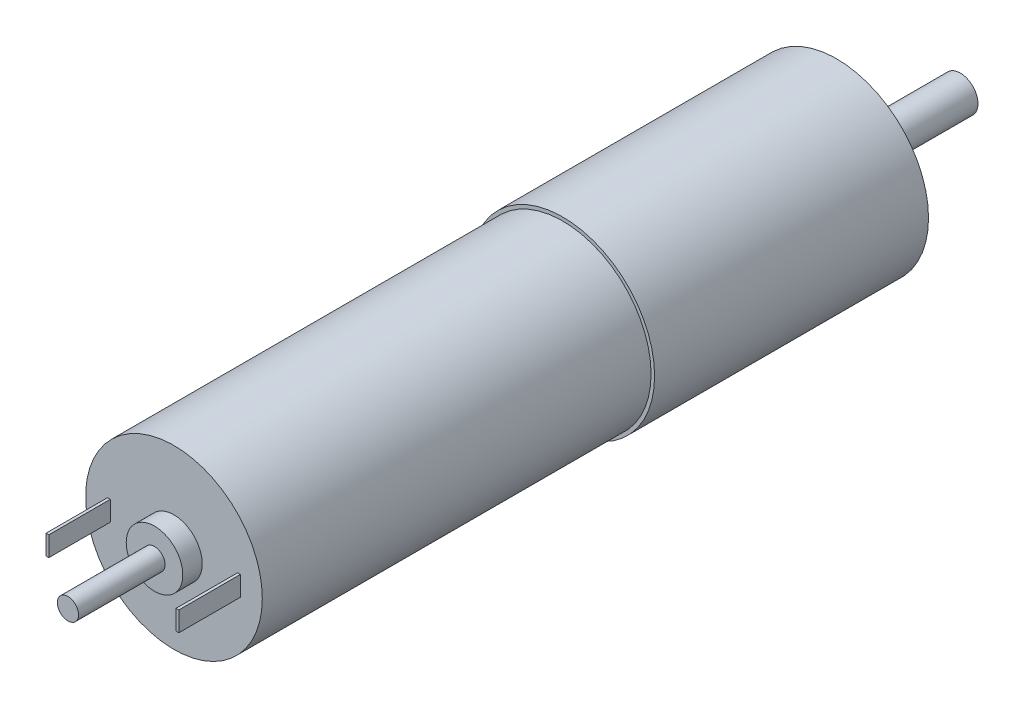
ISO-10303-21;
HEADER;
FILE_DESCRIPTION(('STEP AP214'),'2;1');
FILE_NAME('part.step','',(''),(''),'','','');
FILE_SCHEMA(('AUTOMOTIVE_DESIGN { 1 0 10303 214 1 1 1 1 }'));
ENDSEC;
DATA;
#1=APPLICATION_CONTEXT('core data for automotive mechanical design processes');
#2=APPLICATION_PROTOCOL_DEFINITION('international standard','automotive_design',2000,#1);
#3=PRODUCT_CONTEXT('',#1,'mechanical');
#4=PRODUCT('Part','Part','',(#3));
#5=PRODUCT_RELATED_PRODUCT_CATEGORY('part','',(#4));
#6=PRODUCT_DEFINITION_FORMATION('','',#4);
#7=PRODUCT_DEFINITION_CONTEXT('part definition',#1,'design');
#8=PRODUCT_DEFINITION('design','',#6,#7);
#9=PRODUCT_DEFINITION_SHAPE('','',#8);
#10=(LENGTH_UNIT() NAMED_UNIT(*) SI_UNIT(.MILLI.,.METRE.));
#11=(NAMED_UNIT(*) PLANE_ANGLE_UNIT() SI_UNIT($,.RADIAN.));
#12=(NAMED_UNIT(*) SI_UNIT($,.STERADIAN.) SOLID_ANGLE_UNIT());
#13=UNCERTAINTY_MEASURE_WITH_UNIT(LENGTH_MEASURE(1.E-05),#10,'distance_accuracy_value','');
#14=(GEOMETRIC_REPRESENTATION_CONTEXT(3) GLOBAL_UNCERTAINTY_ASSIGNED_CONTEXT((#13)) GLOBAL_UNIT_ASSIGNED_CONTEXT((#10,
#11,#12)) REPRESENTATION_CONTEXT('',''));
#15=CARTESIAN_POINT('',(0.,0.,0.));
#16=DIRECTION('',(0.,0.,1.));
#17=DIRECTION('',(1.,0.,0.));
#18=AXIS2_PLACEMENT_3D('',#15,#16,#17);
#19=CARTESIAN_POINT('',(0.,0.,0.));
#20=DIRECTION('',(0.,0.,-1.));
#21=DIRECTION('',(1.,0.,0.));
#22=AXIS2_PLACEMENT_3D('',#19,#20,#21);
#23=PLANE('',#22);
#24=CARTESIAN_POINT('',(0.,0.,0.));
#25=DIRECTION('',(0.,0.,1.));
#26=DIRECTION('',(1.,0.,0.));
#27=AXIS2_PLACEMENT_3D('',#24,#25,#26);
#28=CIRCLE('',#27,12.5);
#29=CARTESIAN_POINT('',(12.5,0.,0.));
#30=VERTEX_POINT('',#29);
#31=EDGE_CURVE('E215',#30,#30,#28,.T.);
#32=ORIENTED_EDGE('',*,*,#31,.T.);
#33=EDGE_LOOP('',(#32));
#34=FACE_BOUND('',#33,.T.);
#35=CARTESIAN_POINT('',(0.,0.,0.));
#36=DIRECTION('',(0.,0.,-1.));
#37=DIRECTION('',(-1.,0.,0.));
#38=AXIS2_PLACEMENT_3D('',#35,#36,#37);
#39=CIRCLE('',#38,4.);
#40=CARTESIAN_POINT('',(-4.,0.,0.));
#41=VERTEX_POINT('',#40);
#42=EDGE_CURVE('E11',#41,#41,#39,.T.);
#43=ORIENTED_EDGE('',*,*,#42,.T.);
#44=EDGE_LOOP('',(#43));
#45=FACE_BOUND('',#44,.T.);
#46=DIRECTION('',(1.,0.,0.));
#47=VECTOR('',#46,1.);
#48=CARTESIAN_POINT('',(0.,-1.40000000000001,0.));
#49=LINE('',#48,#47);
#50=CARTESIAN_POINT('',(-9.4,-1.4,0.));
#51=VERTEX_POINT('',#50);
#52=CARTESIAN_POINT('',(-9.,-1.4,0.));
#53=VERTEX_POINT('',#52);
#54=EDGE_CURVE('E154',#51,#53,#49,.T.);
#55=ORIENTED_EDGE('',*,*,#54,.F.);
#56=DIRECTION('',(0.,-1.,0.));
#57=VECTOR('',#56,1.);
#58=CARTESIAN_POINT('',(-9.4,0.,0.));
#59=LINE('',#58,#57);
#60=CARTESIAN_POINT('',(-9.4,1.4,0.));
#61=VERTEX_POINT('',#60);
#62=EDGE_CURVE('E157',#61,#51,#59,.T.);
#63=ORIENTED_EDGE('',*,*,#62,.F.);
#64=DIRECTION('',(-1.,0.,0.));
#65=VECTOR('',#64,1.);
#66=CARTESIAN_POINT('',(0.,1.40000000000001,0.));
#67=LINE('',#66,#65);
#68=CARTESIAN_POINT('',(-9.,1.4,0.));
#69=VERTEX_POINT('',#68);
#70=EDGE_CURVE('E145',#69,#61,#67,.T.);
#71=ORIENTED_EDGE('',*,*,#70,.F.);
#72=DIRECTION('',(0.,1.,0.));
#73=VECTOR('',#72,1.);
#74=CARTESIAN_POINT('',(-9.,0.,0.));
#75=LINE('',#74,#73);
#76=EDGE_CURVE('E119',#53,#69,#75,.T.);
#77=ORIENTED_EDGE('',*,*,#76,.F.);
#78=EDGE_LOOP('',(#55,#63,#71,#77));
#79=FACE_BOUND('',#78,.T.);
#80=DIRECTION('',(-1.,0.,0.));
#81=VECTOR('',#80,1.);
#82=CARTESIAN_POINT('',(0.,-1.40000000000001,0.));
#83=LINE('',#82,#81);
#84=CARTESIAN_POINT('',(9.4,-1.4,0.));
#85=VERTEX_POINT('',#84);
#86=CARTESIAN_POINT('',(9.,-1.4,0.));
#87=VERTEX_POINT('',#86);
#88=EDGE_CURVE('E132',#85,#87,#83,.T.);
#89=ORIENTED_EDGE('',*,*,#88,.T.);
#90=DIRECTION('',(0.,1.,0.));
#91=VECTOR('',#90,1.);
#92=CARTESIAN_POINT('',(9.,0.,0.));
#93=LINE('',#92,#91);
#94=CARTESIAN_POINT('',(9.,1.4,0.));
#95=VERTEX_POINT('',#94);
#96=EDGE_CURVE('E117',#87,#95,#93,.T.);
#97=ORIENTED_EDGE('',*,*,#96,.T.);
#98=DIRECTION('',(1.,0.,0.));
#99=VECTOR('',#98,1.);
#100=CARTESIAN_POINT('',(0.,1.40000000000001,0.));
#101=LINE('',#100,#99);
#102=CARTESIAN_POINT('',(9.4,1.4,0.));
#103=VERTEX_POINT('',#102);
#104=EDGE_CURVE('E126',#95,#103,#101,.T.);
#105=ORIENTED_EDGE('',*,*,#104,.T.);
#106=DIRECTION('',(0.,-1.,0.));
#107=VECTOR('',#106,1.);
#108=CARTESIAN_POINT('',(9.4,0.,0.));
#109=LINE('',#108,#107);
#110=EDGE_CURVE('E123',#103,#85,#109,.T.);
#111=ORIENTED_EDGE('',*,*,#110,.T.);
#112=EDGE_LOOP('',(#89,#97,#105,#111));
#113=FACE_BOUND('',#112,.T.);
#114=ADVANCED_FACE('F39',(#34,#45,#79,#113),#23,.F.);
#115=CARTESIAN_POINT('',(0.,0.,-55.));
#116=DIRECTION('',(0.,0.,1.));
#117=DIRECTION('',(-1.,0.,0.));
#118=AXIS2_PLACEMENT_3D('',#115,#116,#117);
#119=CYLINDRICAL_SURFACE('',#118,12.5);
#120=CARTESIAN_POINT('',(0.,0.,-55.));
#121=DIRECTION('',(0.,0.,1.));
#122=DIRECTION('',(1.,0.,0.));
#123=AXIS2_PLACEMENT_3D('',#120,#121,#122);
#124=CIRCLE('',#123,12.5);
#125=CARTESIAN_POINT('',(12.5,0.,-55.));
#126=VERTEX_POINT('',#125);
#127=EDGE_CURVE('E211',#126,#126,#124,.T.);
#128=ORIENTED_EDGE('',*,*,#127,.T.);
#129=EDGE_LOOP('',(#128));
#130=FACE_BOUND('',#129,.T.);
#131=ORIENTED_EDGE('',*,*,#31,.F.);
#132=EDGE_LOOP('',(#131));
#133=FACE_BOUND('',#132,.T.);
#134=ADVANCED_FACE('F41',(#130,#133),#119,.T.);
#135=CARTESIAN_POINT('',(0.,0.,-93.75));
#136=DIRECTION('',(0.,0.,1.));
#137=DIRECTION('',(-1.,0.,0.));
#138=AXIS2_PLACEMENT_3D('',#135,#136,#137);
#139=CYLINDRICAL_SURFACE('',#138,13.);
#140=CARTESIAN_POINT('',(0.,0.,-93.75));
#141=DIRECTION('',(0.,0.,1.));
#142=DIRECTION('',(1.,0.,0.));
#143=AXIS2_PLACEMENT_3D('',#140,#141,#142);
#144=CIRCLE('',#143,13.);
#145=CARTESIAN_POINT('',(13.,0.,-93.75));
#146=VERTEX_POINT('',#145);
#147=EDGE_CURVE('E212',#146,#146,#144,.T.);
#148=ORIENTED_EDGE('',*,*,#147,.T.);
#149=EDGE_LOOP('',(#148));
#150=FACE_BOUND('',#149,.T.);
#151=CARTESIAN_POINT('',(0.,0.,-55.));
#152=DIRECTION('',(0.,0.,1.));
#153=DIRECTION('',(1.,0.,0.));
#154=AXIS2_PLACEMENT_3D('',#151,#152,#153);
#155=CIRCLE('',#154,13.);
#156=CARTESIAN_POINT('',(13.,0.,-55.));
#157=VERTEX_POINT('',#156);
#158=EDGE_CURVE('E208',#157,#157,#155,.T.);
#159=ORIENTED_EDGE('',*,*,#158,.F.);
#160=EDGE_LOOP('',(#159));
#161=FACE_BOUND('',#160,.T.);
#162=ADVANCED_FACE('F225',(#150,#161),#139,.T.);
#163=CARTESIAN_POINT('',(0.,0.,-93.75));
#164=DIRECTION('',(0.,0.,-1.));
#165=DIRECTION('',(1.,0.,0.));
#166=AXIS2_PLACEMENT_3D('',#163,#164,#165);
#167=PLANE('',#166);
#168=CARTESIAN_POINT('',(0.,10.,-93.75));
#169=DIRECTION('',(0.,0.,1.));
#170=DIRECTION('',(1.,0.,0.));
#171=AXIS2_PLACEMENT_3D('',#168,#169,#170);
#172=CIRCLE('',#171,1.);
#173=CARTESIAN_POINT('',(1.,10.,-93.75));
#174=VERTEX_POINT('',#173);
#175=EDGE_CURVE('E180',#174,#174,#172,.T.);
#176=ORIENTED_EDGE('',*,*,#175,.T.);
#177=EDGE_LOOP('',(#176));
#178=FACE_BOUND('',#177,.T.);
#179=CARTESIAN_POINT('',(10.,0.,-93.75));
#180=DIRECTION('',(0.,0.,1.));
#181=DIRECTION('',(1.,0.,0.));
#182=AXIS2_PLACEMENT_3D('',#179,#180,#181);
#183=CIRCLE('',#182,0.999999999999999);
#184=CARTESIAN_POINT('',(11.,0.,-93.75));
#185=VERTEX_POINT('',#184);
#186=EDGE_CURVE('E186',#185,#185,#183,.T.);
#187=ORIENTED_EDGE('',*,*,#186,.T.);
#188=EDGE_LOOP('',(#187));
#189=FACE_BOUND('',#188,.T.);
#190=CARTESIAN_POINT('',(0.,-10.,-93.75));
#191=DIRECTION('',(0.,0.,1.));
#192=DIRECTION('',(1.,0.,0.));
#193=AXIS2_PLACEMENT_3D('',#190,#191,#192);
#194=CIRCLE('',#193,1.);
#195=CARTESIAN_POINT('',(1.,-10.,-93.75));
#196=VERTEX_POINT('',#195);
#197=EDGE_CURVE('E192',#196,#196,#194,.T.);
#198=ORIENTED_EDGE('',*,*,#197,.T.);
#199=EDGE_LOOP('',(#198));
#200=FACE_BOUND('',#199,.T.);
#201=CARTESIAN_POINT('',(-10.,0.,-93.75));
#202=DIRECTION('',(0.,0.,1.));
#203=DIRECTION('',(1.,0.,0.));
#204=AXIS2_PLACEMENT_3D('',#201,#202,#203);
#205=CIRCLE('',#204,0.999999999999999);
#206=CARTESIAN_POINT('',(-9.,0.,-93.75));
#207=VERTEX_POINT('',#206);
#208=EDGE_CURVE('E174',#207,#207,#205,.T.);
#209=ORIENTED_EDGE('',*,*,#208,.T.);
#210=EDGE_LOOP('',(#209));
#211=FACE_BOUND('',#210,.T.);
#212=CARTESIAN_POINT('',(0.,0.,-93.75));
#213=DIRECTION('',(0.,0.,1.));
#214=DIRECTION('',(1.,0.,0.));
#215=AXIS2_PLACEMENT_3D('',#212,#213,#214);
#216=CIRCLE('',#215,7.);
#217=CARTESIAN_POINT('',(-7.,0.,-93.75));
#218=VERTEX_POINT('',#217);
#219=EDGE_CURVE('E205',#218,#218,#216,.T.);
#220=ORIENTED_EDGE('',*,*,#219,.T.);
#221=EDGE_LOOP('',(#220));
#222=FACE_BOUND('',#221,.T.);
#223=ORIENTED_EDGE('',*,*,#147,.F.);
#224=EDGE_LOOP('',(#223));
#225=FACE_BOUND('',#224,.T.);
#226=ADVANCED_FACE('F231',(#178,#189,#200,#211,#222,#225),#167,.T.);
#227=CARTESIAN_POINT('',(0.,0.,-55.));
#228=DIRECTION('',(0.,0.,-1.));
#229=DIRECTION('',(1.,0.,0.));
#230=AXIS2_PLACEMENT_3D('',#227,#228,#229);
#231=PLANE('',#230);
#232=ORIENTED_EDGE('',*,*,#127,.F.);
#233=EDGE_LOOP('',(#232));
#234=FACE_BOUND('',#233,.T.);
#235=ORIENTED_EDGE('',*,*,#158,.T.);
#236=EDGE_LOOP('',(#235));
#237=FACE_BOUND('',#236,.T.);
#238=ADVANCED_FACE('F236',(#234,#237),#231,.F.);
#239=CARTESIAN_POINT('',(0.,0.,-96.75));
#240=DIRECTION('',(0.,0.,1.));
#241=DIRECTION('',(-1.,0.,0.));
#242=AXIS2_PLACEMENT_3D('',#239,#240,#241);
#243=CYLINDRICAL_SURFACE('',#242,7.);
#244=CARTESIAN_POINT('',(0.,0.,-96.75));
#245=DIRECTION('',(0.,0.,1.));
#246=DIRECTION('',(1.,0.,0.));
#247=AXIS2_PLACEMENT_3D('',#244,#245,#246);
#248=CIRCLE('',#247,7.);
#249=CARTESIAN_POINT('',(-7.,0.,-96.75));
#250=VERTEX_POINT('',#249);
#251=EDGE_CURVE('E202',#250,#250,#248,.T.);
#252=CARTESIAN_POINT('',(-7.,0.,-96.75));
#253=CARTESIAN_POINT('',(-7.,0.,-96.71875));
#254=CARTESIAN_POINT('',(-7.,0.,-96.6875));
#255=CARTESIAN_POINT('',(-7.,0.,-96.625));
#256=CARTESIAN_POINT('',(-7.,0.,-96.59375));
#257=CARTESIAN_POINT('',(-7.,0.,-96.53125));
#258=CARTESIAN_POINT('',(-7.,0.,-96.5));
#259=CARTESIAN_POINT('',(-7.,0.,-96.4375));
#260=CARTESIAN_POINT('',(-7.,0.,-96.40625));
#261=CARTESIAN_POINT('',(-7.,0.,-96.34375));
#262=CARTESIAN_POINT('',(-7.,0.,-96.3125));
#263=CARTESIAN_POINT('',(-7.,0.,-96.25));
#264=CARTESIAN_POINT('',(-7.,0.,-96.21875));
#265=CARTESIAN_POINT('',(-7.,0.,-96.15625));
#266=CARTESIAN_POINT('',(-7.,0.,-96.125));
#267=CARTESIAN_POINT('',(-7.,0.,-96.0625));
#268=CARTESIAN_POINT('',(-7.,0.,-96.03125));
#269=CARTESIAN_POINT('',(-7.,0.,-95.96875));
#270=CARTESIAN_POINT('',(-7.,0.,-95.9375));
#271=CARTESIAN_POINT('',(-7.,0.,-95.875));
#272=CARTESIAN_POINT('',(-7.,0.,-95.84375));
#273=CARTESIAN_POINT('',(-7.,0.,-95.78125));
#274=CARTESIAN_POINT('',(-7.,0.,-95.75));
#275=CARTESIAN_POINT('',(-7.,0.,-95.6875));
#276=CARTESIAN_POINT('',(-7.,0.,-95.65625));
#277=CARTESIAN_POINT('',(-7.,0.,-95.59375));
#278=CARTESIAN_POINT('',(-7.,0.,-95.5625));
#279=CARTESIAN_POINT('',(-7.,0.,-95.5));
#280=CARTESIAN_POINT('',(-7.,0.,-95.46875));
#281=CARTESIAN_POINT('',(-7.,0.,-95.40625));
#282=CARTESIAN_POINT('',(-7.,0.,-95.375));
#283=CARTESIAN_POINT('',(-7.,0.,-95.3125));
#284=CARTESIAN_POINT('',(-7.,0.,-95.28125));
#285=CARTESIAN_POINT('',(-7.,0.,-95.21875));
#286=CARTESIAN_POINT('',(-7.,0.,-95.1875));
#287=CARTESIAN_POINT('',(-7.,0.,-95.125));
#288=CARTESIAN_POINT('',(-7.,0.,-95.09375));
#289=CARTESIAN_POINT('',(-7.,0.,-95.03125));
#290=CARTESIAN_POINT('',(-7.,0.,-95.));
#291=CARTESIAN_POINT('',(-7.,0.,-94.9375));
#292=CARTESIAN_POINT('',(-7.,0.,-94.90625));
#293=CARTESIAN_POINT('',(-7.,0.,-94.84375));
#294=CARTESIAN_POINT('',(-7.,0.,-94.8125));
#295=CARTESIAN_POINT('',(-7.,0.,-94.75));
#296=CARTESIAN_POINT('',(-7.,0.,-94.71875));
#297=CARTESIAN_POINT('',(-7.,0.,-94.65625));
#298=CARTESIAN_POINT('',(-7.,0.,-94.625));
#299=CARTESIAN_POINT('',(-7.,0.,-94.5625));
#300=CARTESIAN_POINT('',(-7.,0.,-94.53125));
#301=CARTESIAN_POINT('',(-7.,0.,-94.46875));
#302=CARTESIAN_POINT('',(-7.,0.,-94.4375));
#303=CARTESIAN_POINT('',(-7.,0.,-94.375));
#304=CARTESIAN_POINT('',(-7.,0.,-94.34375));
#305=CARTESIAN_POINT('',(-7.,0.,-94.28125));
#306=CARTESIAN_POINT('',(-7.,0.,-94.25));
#307=CARTESIAN_POINT('',(-7.,0.,-94.1875));
#308=CARTESIAN_POINT('',(-7.,0.,-94.15625));
#309=CARTESIAN_POINT('',(-7.,0.,-94.09375));
#310=CARTESIAN_POINT('',(-7.,0.,-94.0625));
#311=CARTESIAN_POINT('',(-7.,0.,-94.));
#312=CARTESIAN_POINT('',(-7.,0.,-93.96875));
#313=CARTESIAN_POINT('',(-7.,0.,-93.90625));
#314=CARTESIAN_POINT('',(-7.,0.,-93.875));
#315=CARTESIAN_POINT('',(-7.,0.,-93.8125));
#316=CARTESIAN_POINT('',(-7.,0.,-93.78125));
#317=CARTESIAN_POINT('',(-7.,0.,-93.75));
#318=B_SPLINE_CURVE_WITH_KNOTS('',3,(#252,#253,#254,#255,#256,#257,#258,#259,#260,#261,#262,
#263,#264,#265,#266,#267,#268,#269,#270,#271,#272,#273,#274,#275,#276,#277,#278,#279,#280,#281,
#282,#283,#284,#285,#286,#287,#288,#289,#290,#291,#292,#293,#294,#295,#296,#297,#298,#299,#300,
#301,#302,#303,#304,#305,#306,#307,#308,#309,#310,#311,#312,#313,#314,#315,#316,#317),
.UNSPECIFIED.,.F.,.F.,(4,2,2,2,2,2,2,2,2,2,2,2,2,2,2,2,2,2,2,2,2,2,2,2,2,2,2,2,2,2,2,2,4),(0.,
0.0937499999999897,0.187499999999993,0.281249999999997,0.374999999999986,0.46874999999999,
0.562499999999994,0.656249999999997,0.749999999999987,0.84374999999999,0.937499999999994,
1.03125,1.12499999999999,1.21874999999999,1.31249999999999,1.40625,1.49999999999999,
1.59374999999999,1.68749999999999,1.78125,1.87499999999999,1.96874999999999,2.06249999999999,
2.15625,2.24999999999999,2.34374999999999,2.4375,2.53125,2.62499999999999,2.71874999999999,
2.8125,2.90625,2.99999999999999),.UNSPECIFIED.);
#319=EDGE_CURVE('BSEAM239',#250,#218,#318,.T.);
#320=ORIENTED_EDGE('',*,*,#251,.T.);
#321=ORIENTED_EDGE('',*,*,#219,.F.);
#322=ORIENTED_EDGE('',*,*,#319,.T.);
#323=ORIENTED_EDGE('',*,*,#319,.F.);
#324=EDGE_LOOP('',(#320,#322,#321,#323));
#325=FACE_BOUND('',#324,.T.);
#326=ADVANCED_FACE('F239',(#325),#243,.T.);
#327=CARTESIAN_POINT('',(0.,0.,-96.75));
#328=DIRECTION('',(0.,0.,-1.));
#329=DIRECTION('',(1.,0.,0.));
#330=AXIS2_PLACEMENT_3D('',#327,#328,#329);
#331=PLANE('',#330);
#332=CARTESIAN_POINT('',(0.,0.,-96.75));
#333=DIRECTION('',(0.,0.,1.));
#334=DIRECTION('',(1.,0.,0.));
#335=AXIS2_PLACEMENT_3D('',#332,#333,#334);
#336=CIRCLE('',#335,2.5);
#337=CARTESIAN_POINT('',(2.5,0.,-96.75));
#338=VERTEX_POINT('',#337);
#339=EDGE_CURVE('E48',#338,#338,#336,.T.);
#340=ORIENTED_EDGE('',*,*,#339,.T.);
#341=EDGE_LOOP('',(#340));
#342=FACE_BOUND('',#341,.T.);
#343=ORIENTED_EDGE('',*,*,#251,.F.);
#344=EDGE_LOOP('',(#343));
#345=FACE_BOUND('',#344,.T.);
#346=ADVANCED_FACE('F247',(#342,#345),#331,.T.);
#347=CARTESIAN_POINT('',(0.,0.,-111.25));
#348=DIRECTION('',(0.,0.,1.));
#349=DIRECTION('',(-1.,0.,0.));
#350=AXIS2_PLACEMENT_3D('',#347,#348,#349);
#351=CYLINDRICAL_SURFACE('',#350,2.5);
#352=CARTESIAN_POINT('',(0.,0.,-111.25));
#353=DIRECTION('',(0.,0.,1.));
#354=DIRECTION('',(1.,0.,0.));
#355=AXIS2_PLACEMENT_3D('',#352,#353,#354);
#356=CIRCLE('',#355,2.5);
#357=CARTESIAN_POINT('',(2.5,0.,-111.25));
#358=VERTEX_POINT('',#357);
#359=EDGE_CURVE('E179',#358,#358,#356,.T.);
#360=ORIENTED_EDGE('',*,*,#359,.T.);
#361=EDGE_LOOP('',(#360));
#362=FACE_BOUND('',#361,.T.);
#363=ORIENTED_EDGE('',*,*,#339,.F.);
#364=EDGE_LOOP('',(#363));
#365=FACE_BOUND('',#364,.T.);
#366=ADVANCED_FACE('F255',(#362,#365),#351,.T.);
#367=CARTESIAN_POINT('',(0.,0.,-111.25));
#368=DIRECTION('',(0.,0.,-1.));
#369=DIRECTION('',(1.,0.,0.));
#370=AXIS2_PLACEMENT_3D('',#367,#368,#369);
#371=PLANE('',#370);
#372=ORIENTED_EDGE('',*,*,#359,.F.);
#373=EDGE_LOOP('',(#372));
#374=FACE_BOUND('',#373,.T.);
#375=ADVANCED_FACE('F259',(#374),#371,.T.);
#376=CARTESIAN_POINT('',(-10.,0.,-89.75));
#377=DIRECTION('',(0.,0.,-1.));
#378=DIRECTION('',(1.,0.,0.));
#379=AXIS2_PLACEMENT_3D('',#376,#377,#378);
#380=CYLINDRICAL_SURFACE('',#379,0.999999999999999);
#381=CARTESIAN_POINT('',(-10.,0.,-89.75));
#382=DIRECTION('',(0.,0.,1.));
#383=DIRECTION('',(1.,0.,0.));
#384=AXIS2_PLACEMENT_3D('',#381,#382,#383);
#385=CIRCLE('',#384,0.999999999999999);
#386=CARTESIAN_POINT('',(-9.,0.,-89.75));
#387=VERTEX_POINT('',#386);
#388=EDGE_CURVE('E195',#387,#387,#385,.T.);
#389=ORIENTED_EDGE('',*,*,#388,.T.);
#390=EDGE_LOOP('',(#389));
#391=FACE_BOUND('',#390,.T.);
#392=ORIENTED_EDGE('',*,*,#208,.F.);
#393=EDGE_LOOP('',(#392));
#394=FACE_BOUND('',#393,.T.);
#395=ADVANCED_FACE('F263',(#391,#394),#380,.F.);
#396=CARTESIAN_POINT('',(0.,0.,-89.75));
#397=DIRECTION('',(0.,0.,-1.));
#398=DIRECTION('',(1.,0.,0.));
#399=AXIS2_PLACEMENT_3D('',#396,#397,#398);
#400=PLANE('',#399);
#401=ORIENTED_EDGE('',*,*,#388,.F.);
#402=EDGE_LOOP('',(#401));
#403=FACE_BOUND('',#402,.T.);
#404=ADVANCED_FACE('F267',(#403),#400,.T.);
#405=CARTESIAN_POINT('',(0.,-10.,-89.75));
#406=DIRECTION('',(0.,0.,-1.));
#407=DIRECTION('',(1.,0.,0.));
#408=AXIS2_PLACEMENT_3D('',#405,#406,#407);
#409=CYLINDRICAL_SURFACE('',#408,1.);
#410=CARTESIAN_POINT('',(0.,-10.,-89.75));
#411=DIRECTION('',(0.,0.,1.));
#412=DIRECTION('',(1.,0.,0.));
#413=AXIS2_PLACEMENT_3D('',#410,#411,#412);
#414=CIRCLE('',#413,1.);
#415=CARTESIAN_POINT('',(1.,-10.,-89.75));
#416=VERTEX_POINT('',#415);
#417=EDGE_CURVE('E189',#416,#416,#414,.T.);
#418=ORIENTED_EDGE('',*,*,#417,.T.);
#419=EDGE_LOOP('',(#418));
#420=FACE_BOUND('',#419,.T.);
#421=ORIENTED_EDGE('',*,*,#197,.F.);
#422=EDGE_LOOP('',(#421));
#423=FACE_BOUND('',#422,.T.);
#424=ADVANCED_FACE('F271',(#420,#423),#409,.F.);
#425=CARTESIAN_POINT('',(0.,0.,-89.75));
#426=DIRECTION('',(0.,0.,-1.));
#427=DIRECTION('',(1.,0.,0.));
#428=AXIS2_PLACEMENT_3D('',#425,#426,#427);
#429=PLANE('',#428);
#430=ORIENTED_EDGE('',*,*,#417,.F.);
#431=EDGE_LOOP('',(#430));
#432=FACE_BOUND('',#431,.T.);
#433=ADVANCED_FACE('F275',(#432),#429,.T.);
#434=CARTESIAN_POINT('',(10.,0.,-89.75));
#435=DIRECTION('',(0.,0.,-1.));
#436=DIRECTION('',(1.,0.,0.));
#437=AXIS2_PLACEMENT_3D('',#434,#435,#436);
#438=CYLINDRICAL_SURFACE('',#437,0.999999999999999);
#439=CARTESIAN_POINT('',(10.,0.,-89.75));
#440=DIRECTION('',(0.,0.,1.));
#441=DIRECTION('',(1.,0.,0.));
#442=AXIS2_PLACEMENT_3D('',#439,#440,#441);
#443=CIRCLE('',#442,0.999999999999999);
#444=CARTESIAN_POINT('',(11.,0.,-89.75));
#445=VERTEX_POINT('',#444);
#446=EDGE_CURVE('E183',#445,#445,#443,.T.);
#447=ORIENTED_EDGE('',*,*,#446,.T.);
#448=EDGE_LOOP('',(#447));
#449=FACE_BOUND('',#448,.T.);
#450=ORIENTED_EDGE('',*,*,#186,.F.);
#451=EDGE_LOOP('',(#450));
#452=FACE_BOUND('',#451,.T.);
#453=ADVANCED_FACE('F279',(#449,#452),#438,.F.);
#454=CARTESIAN_POINT('',(0.,0.,-89.75));
#455=DIRECTION('',(0.,0.,-1.));
#456=DIRECTION('',(1.,0.,0.));
#457=AXIS2_PLACEMENT_3D('',#454,#455,#456);
#458=PLANE('',#457);
#459=ORIENTED_EDGE('',*,*,#446,.F.);
#460=EDGE_LOOP('',(#459));
#461=FACE_BOUND('',#460,.T.);
#462=ADVANCED_FACE('F283',(#461),#458,.T.);
#463=CARTESIAN_POINT('',(0.,10.,-89.75));
#464=DIRECTION('',(0.,0.,-1.));
#465=DIRECTION('',(1.,0.,0.));
#466=AXIS2_PLACEMENT_3D('',#463,#464,#465);
#467=CYLINDRICAL_SURFACE('',#466,1.);
#468=CARTESIAN_POINT('',(0.,10.,-89.75));
#469=DIRECTION('',(0.,0.,1.));
#470=DIRECTION('',(1.,0.,0.));
#471=AXIS2_PLACEMENT_3D('',#468,#469,#470);
#472=CIRCLE('',#471,1.);
#473=CARTESIAN_POINT('',(1.,10.,-89.75));
#474=VERTEX_POINT('',#473);
#475=EDGE_CURVE('E176',#474,#474,#472,.T.);
#476=ORIENTED_EDGE('',*,*,#475,.T.);
#477=EDGE_LOOP('',(#476));
#478=FACE_BOUND('',#477,.T.);
#479=ORIENTED_EDGE('',*,*,#175,.F.);
#480=EDGE_LOOP('',(#479));
#481=FACE_BOUND('',#480,.T.);
#482=ADVANCED_FACE('F287',(#478,#481),#467,.F.);
#483=CARTESIAN_POINT('',(0.,0.,-89.75));
#484=DIRECTION('',(0.,0.,-1.));
#485=DIRECTION('',(1.,0.,0.));
#486=AXIS2_PLACEMENT_3D('',#483,#484,#485);
#487=PLANE('',#486);
#488=ORIENTED_EDGE('',*,*,#475,.F.);
#489=EDGE_LOOP('',(#488));
#490=FACE_BOUND('',#489,.T.);
#491=ADVANCED_FACE('F291',(#490),#487,.T.);
#492=CARTESIAN_POINT('',(0.,0.,2.75));
#493=DIRECTION('',(0.,0.,-1.));
#494=DIRECTION('',(1.,0.,0.));
#495=AXIS2_PLACEMENT_3D('',#492,#493,#494);
#496=CYLINDRICAL_SURFACE('',#495,4.);
#497=CARTESIAN_POINT('',(0.,0.,2.75));
#498=DIRECTION('',(0.,0.,-1.));
#499=DIRECTION('',(-1.,0.,0.));
#500=AXIS2_PLACEMENT_3D('',#497,#498,#499);
#501=CIRCLE('',#500,4.);
#502=CARTESIAN_POINT('',(-4.,0.,2.75));
#503=VERTEX_POINT('',#502);
#504=EDGE_CURVE('E172',#503,#503,#501,.T.);
#505=ORIENTED_EDGE('',*,*,#504,.T.);
#506=EDGE_LOOP('',(#505));
#507=FACE_BOUND('',#506,.T.);
#508=ORIENTED_EDGE('',*,*,#42,.F.);
#509=EDGE_LOOP('',(#508));
#510=FACE_BOUND('',#509,.T.);
#511=ADVANCED_FACE('F295',(#507,#510),#496,.T.);
#512=CARTESIAN_POINT('',(0.,0.,2.75));
#513=DIRECTION('',(0.,0.,1.));
#514=DIRECTION('',(-1.,0.,0.));
#515=AXIS2_PLACEMENT_3D('',#512,#513,#514);
#516=PLANE('',#515);
#517=CARTESIAN_POINT('',(0.,0.,2.75));
#518=DIRECTION('',(0.,0.,-1.));
#519=DIRECTION('',(-1.,0.,0.));
#520=AXIS2_PLACEMENT_3D('',#517,#518,#519);
#521=CIRCLE('',#520,1.5);
#522=CARTESIAN_POINT('',(-1.5,0.,2.75));
#523=VERTEX_POINT('',#522);
#524=EDGE_CURVE('E43',#523,#523,#521,.F.);
#525=ORIENTED_EDGE('',*,*,#524,.F.);
#526=EDGE_LOOP('',(#525));
#527=FACE_BOUND('',#526,.T.);
#528=ORIENTED_EDGE('',*,*,#504,.F.);
#529=EDGE_LOOP('',(#528));
#530=FACE_BOUND('',#529,.T.);
#531=ADVANCED_FACE('F299',(#527,#530),#516,.T.);
#532=CARTESIAN_POINT('',(0.,0.,15.));
#533=DIRECTION('',(0.,0.,-1.));
#534=DIRECTION('',(1.,0.,0.));
#535=AXIS2_PLACEMENT_3D('',#532,#533,#534);
#536=CYLINDRICAL_SURFACE('',#535,1.5);
#537=ORIENTED_EDGE('',*,*,#524,.T.);
#538=EDGE_LOOP('',(#537));
#539=FACE_BOUND('',#538,.T.);
#540=CARTESIAN_POINT('',(0.,0.,15.));
#541=DIRECTION('',(0.,0.,-1.));
#542=DIRECTION('',(-1.,0.,0.));
#543=AXIS2_PLACEMENT_3D('',#540,#541,#542);
#544=CIRCLE('',#543,1.5);
#545=CARTESIAN_POINT('',(-1.5,0.,15.));
#546=VERTEX_POINT('',#545);
#547=EDGE_CURVE('E169',#546,#546,#544,.T.);
#548=ORIENTED_EDGE('',*,*,#547,.T.);
#549=EDGE_LOOP('',(#548));
#550=FACE_BOUND('',#549,.T.);
#551=ADVANCED_FACE('F303',(#539,#550),#536,.T.);
#552=CARTESIAN_POINT('',(0.,0.,15.));
#553=DIRECTION('',(0.,0.,1.));
#554=DIRECTION('',(-1.,0.,0.));
#555=AXIS2_PLACEMENT_3D('',#552,#553,#554);
#556=PLANE('',#555);
#557=ORIENTED_EDGE('',*,*,#547,.F.);
#558=EDGE_LOOP('',(#557));
#559=FACE_BOUND('',#558,.T.);
#560=ADVANCED_FACE('F307',(#559),#556,.T.);
#561=CARTESIAN_POINT('',(-9.,0.,8.7));
#562=DIRECTION('',(1.,0.,0.));
#563=DIRECTION('',(0.,0.,1.));
#564=AXIS2_PLACEMENT_3D('',#561,#562,#563);
#565=PLANE('',#564);
#566=ORIENTED_EDGE('',*,*,#76,.T.);
#567=DIRECTION('',(0.,0.,-1.));
#568=VECTOR('',#567,1.);
#569=CARTESIAN_POINT('',(-9.,1.4,8.7));
#570=LINE('',#569,#568);
#571=CARTESIAN_POINT('',(-9.,1.4,8.7));
#572=VERTEX_POINT('',#571);
#573=EDGE_CURVE('E151',#572,#69,#570,.T.);
#574=ORIENTED_EDGE('',*,*,#573,.F.);
#575=DIRECTION('',(0.,1.,0.));
#576=VECTOR('',#575,1.);
#577=CARTESIAN_POINT('',(-9.,0.,8.7));
#578=LINE('',#577,#576);
#579=CARTESIAN_POINT('',(-9.,-1.4,8.7));
#580=VERTEX_POINT('',#579);
#581=EDGE_CURVE('E141',#580,#572,#578,.T.);
#582=ORIENTED_EDGE('',*,*,#581,.F.);
#583=DIRECTION('',(0.,0.,-1.));
#584=VECTOR('',#583,1.);
#585=CARTESIAN_POINT('',(-9.,-1.4,8.7));
#586=LINE('',#585,#584);
#587=EDGE_CURVE('E167',#580,#53,#586,.T.);
#588=ORIENTED_EDGE('',*,*,#587,.T.);
#589=EDGE_LOOP('',(#566,#574,#582,#588));
#590=FACE_BOUND('',#589,.T.);
#591=ADVANCED_FACE('F311',(#590),#565,.T.);
#592=CARTESIAN_POINT('',(0.,-1.40000000000001,8.7));
#593=DIRECTION('',(0.,-1.,0.));
#594=DIRECTION('',(1.,0.,0.));
#595=AXIS2_PLACEMENT_3D('',#592,#593,#594);
#596=PLANE('',#595);
#597=ORIENTED_EDGE('',*,*,#54,.T.);
#598=ORIENTED_EDGE('',*,*,#587,.F.);
#599=DIRECTION('',(1.,0.,0.));
#600=VECTOR('',#599,1.);
#601=CARTESIAN_POINT('',(0.,-1.40000000000001,8.7));
#602=LINE('',#601,#600);
#603=CARTESIAN_POINT('',(-9.4,-1.4,8.7));
#604=VERTEX_POINT('',#603);
#605=EDGE_CURVE('E144',#604,#580,#602,.T.);
#606=ORIENTED_EDGE('',*,*,#605,.F.);
#607=DIRECTION('',(0.,0.,-1.));
#608=VECTOR('',#607,1.);
#609=CARTESIAN_POINT('',(-9.4,-1.4,8.7));
#610=LINE('',#609,#608);
#611=EDGE_CURVE('E165',#604,#51,#610,.T.);
#612=ORIENTED_EDGE('',*,*,#611,.T.);
#613=EDGE_LOOP('',(#597,#598,#606,#612));
#614=FACE_BOUND('',#613,.T.);
#615=ADVANCED_FACE('F315',(#614),#596,.T.);
#616=CARTESIAN_POINT('',(-9.4,0.,8.7));
#617=DIRECTION('',(-1.,0.,0.));
#618=DIRECTION('',(0.,-1.,0.));
#619=AXIS2_PLACEMENT_3D('',#616,#617,#618);
#620=PLANE('',#619);
#621=ORIENTED_EDGE('',*,*,#62,.T.);
#622=ORIENTED_EDGE('',*,*,#611,.F.);
#623=DIRECTION('',(0.,-1.,0.));
#624=VECTOR('',#623,1.);
#625=CARTESIAN_POINT('',(-9.4,0.,8.7));
#626=LINE('',#625,#624);
#627=CARTESIAN_POINT('',(-9.4,1.4,8.7));
#628=VERTEX_POINT('',#627);
#629=EDGE_CURVE('E147',#628,#604,#626,.T.);
#630=ORIENTED_EDGE('',*,*,#629,.F.);
#631=DIRECTION('',(0.,0.,-1.));
#632=VECTOR('',#631,1.);
#633=CARTESIAN_POINT('',(-9.4,1.4,8.7));
#634=LINE('',#633,#632);
#635=EDGE_CURVE('E163',#628,#61,#634,.T.);
#636=ORIENTED_EDGE('',*,*,#635,.T.);
#637=EDGE_LOOP('',(#621,#622,#630,#636));
#638=FACE_BOUND('',#637,.T.);
#639=ADVANCED_FACE('F319',(#638),#620,.T.);
#640=CARTESIAN_POINT('',(0.,1.40000000000001,8.7));
#641=DIRECTION('',(0.,1.,0.));
#642=DIRECTION('',(-1.,0.,0.));
#643=AXIS2_PLACEMENT_3D('',#640,#641,#642);
#644=PLANE('',#643);
#645=ORIENTED_EDGE('',*,*,#70,.T.);
#646=ORIENTED_EDGE('',*,*,#635,.F.);
#647=DIRECTION('',(-1.,0.,0.));
#648=VECTOR('',#647,1.);
#649=CARTESIAN_POINT('',(0.,1.40000000000001,8.7));
#650=LINE('',#649,#648);
#651=EDGE_CURVE('E149',#572,#628,#650,.T.);
#652=ORIENTED_EDGE('',*,*,#651,.F.);
#653=ORIENTED_EDGE('',*,*,#573,.T.);
#654=EDGE_LOOP('',(#645,#646,#652,#653));
#655=FACE_BOUND('',#654,.T.);
#656=ADVANCED_FACE('F323',(#655),#644,.T.);
#657=CARTESIAN_POINT('',(0.,0.,8.7));
#658=DIRECTION('',(0.,0.,1.));
#659=DIRECTION('',(-1.,0.,0.));
#660=AXIS2_PLACEMENT_3D('',#657,#658,#659);
#661=PLANE('',#660);
#662=ORIENTED_EDGE('',*,*,#581,.T.);
#663=ORIENTED_EDGE('',*,*,#651,.T.);
#664=ORIENTED_EDGE('',*,*,#629,.T.);
#665=ORIENTED_EDGE('',*,*,#605,.T.);
#666=EDGE_LOOP('',(#662,#663,#664,#665));
#667=FACE_BOUND('',#666,.T.);
#668=ADVANCED_FACE('F327',(#667),#661,.T.);
#669=CARTESIAN_POINT('',(0.,-1.40000000000001,8.7));
#670=DIRECTION('',(0.,1.,0.));
#671=DIRECTION('',(-1.,0.,0.));
#672=AXIS2_PLACEMENT_3D('',#669,#670,#671);
#673=PLANE('',#672);
#674=ORIENTED_EDGE('',*,*,#88,.F.);
#675=DIRECTION('',(0.,0.,-1.));
#676=VECTOR('',#675,1.);
#677=CARTESIAN_POINT('',(9.4,-1.4,8.7));
#678=LINE('',#677,#676);
#679=CARTESIAN_POINT('',(9.4,-1.4,8.7));
#680=VERTEX_POINT('',#679);
#681=EDGE_CURVE('E122',#680,#85,#678,.T.);
#682=ORIENTED_EDGE('',*,*,#681,.F.);
#683=DIRECTION('',(-1.,0.,0.));
#684=VECTOR('',#683,1.);
#685=CARTESIAN_POINT('',(0.,-1.40000000000001,8.7));
#686=LINE('',#685,#684);
#687=CARTESIAN_POINT('',(9.,-1.4,8.7));
#688=VERTEX_POINT('',#687);
#689=EDGE_CURVE('E110',#680,#688,#686,.T.);
#690=ORIENTED_EDGE('',*,*,#689,.T.);
#691=DIRECTION('',(0.,0.,-1.));
#692=VECTOR('',#691,1.);
#693=CARTESIAN_POINT('',(9.,-1.4,8.7));
#694=LINE('',#693,#692);
#695=EDGE_CURVE('E56',#688,#87,#694,.T.);
#696=ORIENTED_EDGE('',*,*,#695,.T.);
#697=EDGE_LOOP('',(#674,#682,#690,#696));
#698=FACE_BOUND('',#697,.T.);
#699=ADVANCED_FACE('F121',(#698),#673,.F.);
#700=CARTESIAN_POINT('',(9.,0.,8.7));
#701=DIRECTION('',(1.,0.,0.));
#702=DIRECTION('',(0.,0.,1.));
#703=AXIS2_PLACEMENT_3D('',#700,#701,#702);
#704=PLANE('',#703);
#705=ORIENTED_EDGE('',*,*,#96,.F.);
#706=ORIENTED_EDGE('',*,*,#695,.F.);
#707=DIRECTION('',(0.,1.,0.));
#708=VECTOR('',#707,1.);
#709=CARTESIAN_POINT('',(9.,0.,8.7));
#710=LINE('',#709,#708);
#711=CARTESIAN_POINT('',(9.,1.4,8.7));
#712=VERTEX_POINT('',#711);
#713=EDGE_CURVE('E108',#688,#712,#710,.T.);
#714=ORIENTED_EDGE('',*,*,#713,.T.);
#715=DIRECTION('',(0.,0.,-1.));
#716=VECTOR('',#715,1.);
#717=CARTESIAN_POINT('',(9.,1.4,8.7));
#718=LINE('',#717,#716);
#719=EDGE_CURVE('E63',#712,#95,#718,.T.);
#720=ORIENTED_EDGE('',*,*,#719,.T.);
#721=EDGE_LOOP('',(#705,#706,#714,#720));
#722=FACE_BOUND('',#721,.T.);
#723=ADVANCED_FACE('F115',(#722),#704,.F.);
#724=CARTESIAN_POINT('',(0.,1.40000000000001,8.7));
#725=DIRECTION('',(0.,-1.,0.));
#726=DIRECTION('',(1.,0.,0.));
#727=AXIS2_PLACEMENT_3D('',#724,#725,#726);
#728=PLANE('',#727);
#729=ORIENTED_EDGE('',*,*,#104,.F.);
#730=ORIENTED_EDGE('',*,*,#719,.F.);
#731=DIRECTION('',(1.,0.,0.));
#732=VECTOR('',#731,1.);
#733=CARTESIAN_POINT('',(0.,1.40000000000001,8.7));
#734=LINE('',#733,#732);
#735=CARTESIAN_POINT('',(9.4,1.4,8.7));
#736=VERTEX_POINT('',#735);
#737=EDGE_CURVE('E113',#712,#736,#734,.T.);
#738=ORIENTED_EDGE('',*,*,#737,.T.);
#739=DIRECTION('',(0.,0.,-1.));
#740=VECTOR('',#739,1.);
#741=CARTESIAN_POINT('',(9.4,1.4,8.7));
#742=LINE('',#741,#740);
#743=EDGE_CURVE('E138',#736,#103,#742,.T.);
#744=ORIENTED_EDGE('',*,*,#743,.T.);
#745=EDGE_LOOP('',(#729,#730,#738,#744));
#746=FACE_BOUND('',#745,.T.);
#747=ADVANCED_FACE('F336',(#746),#728,.F.);
#748=CARTESIAN_POINT('',(9.4,0.,8.7));
#749=DIRECTION('',(-1.,0.,0.));
#750=DIRECTION('',(0.,-1.,0.));
#751=AXIS2_PLACEMENT_3D('',#748,#749,#750);
#752=PLANE('',#751);
#753=ORIENTED_EDGE('',*,*,#110,.F.);
#754=ORIENTED_EDGE('',*,*,#743,.F.);
#755=DIRECTION('',(0.,-1.,0.));
#756=VECTOR('',#755,1.);
#757=CARTESIAN_POINT('',(9.4,0.,8.7));
#758=LINE('',#757,#756);
#759=EDGE_CURVE('E130',#736,#680,#758,.T.);
#760=ORIENTED_EDGE('',*,*,#759,.T.);
#761=ORIENTED_EDGE('',*,*,#681,.T.);
#762=EDGE_LOOP('',(#753,#754,#760,#761));
#763=FACE_BOUND('',#762,.T.);
#764=ADVANCED_FACE('F339',(#763),#752,.F.);
#765=CARTESIAN_POINT('',(0.,0.,8.7));
#766=DIRECTION('',(0.,0.,1.));
#767=DIRECTION('',(-1.,0.,0.));
#768=AXIS2_PLACEMENT_3D('',#765,#766,#767);
#769=PLANE('',#768);
#770=ORIENTED_EDGE('',*,*,#689,.F.);
#771=ORIENTED_EDGE('',*,*,#759,.F.);
#772=ORIENTED_EDGE('',*,*,#737,.F.);
#773=ORIENTED_EDGE('',*,*,#713,.F.);
#774=EDGE_LOOP('',(#770,#771,#772,#773));
#775=FACE_BOUND('',#774,.T.);
#776=ADVANCED_FACE('F109',(#775),#769,.T.);
#777=CLOSED_SHELL('',(#114,#134,#162,#226,#238,#326,#346,#366,#375,#395,#404,#424,#433,#453,
#462,#482,#491,#511,#531,#551,#560,#591,#615,#639,#656,#668,#699,#723,#747,#764,#776));
#778=MANIFOLD_SOLID_BREP('B2',#777);
#779=ADVANCED_BREP_SHAPE_REPRESENTATION('',(#18,#778),#14);
#780=SHAPE_DEFINITION_REPRESENTATION(#9,#779);
ENDSEC;
END-ISO-10303-21;
